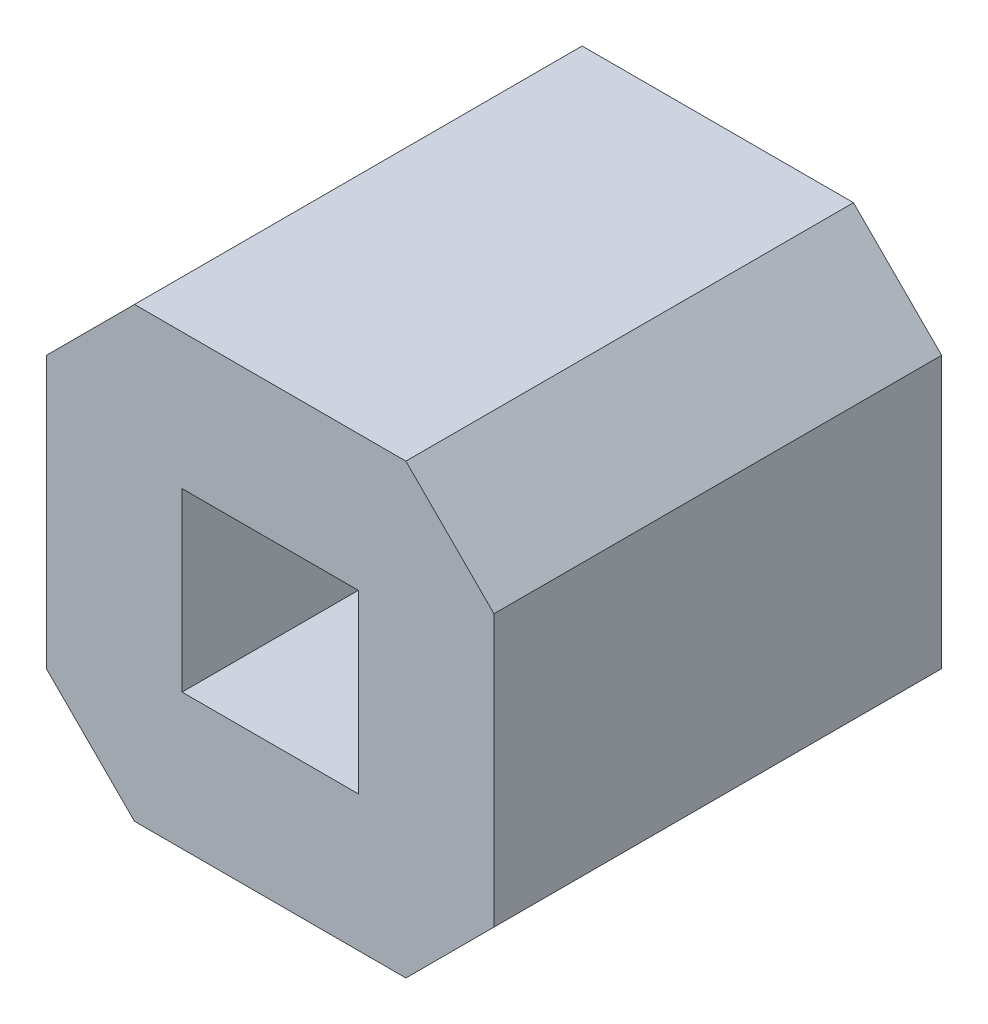
ISO-10303-21;
HEADER;
FILE_DESCRIPTION(('STEP AP214'),'2;1');
FILE_NAME('part.step','',(''),(''),'','','');
FILE_SCHEMA(('AUTOMOTIVE_DESIGN { 1 0 10303 214 1 1 1 1 }'));
ENDSEC;
DATA;
#1=APPLICATION_CONTEXT('core data for automotive mechanical design processes');
#2=APPLICATION_PROTOCOL_DEFINITION('international standard','automotive_design',2000,#1);
#3=PRODUCT_CONTEXT('',#1,'mechanical');
#4=PRODUCT('Part','Part','',(#3));
#5=PRODUCT_RELATED_PRODUCT_CATEGORY('part','',(#4));
#6=PRODUCT_DEFINITION_FORMATION('','',#4);
#7=PRODUCT_DEFINITION_CONTEXT('part definition',#1,'design');
#8=PRODUCT_DEFINITION('design','',#6,#7);
#9=PRODUCT_DEFINITION_SHAPE('','',#8);
#10=(LENGTH_UNIT() NAMED_UNIT(*) SI_UNIT(.MILLI.,.METRE.));
#11=(NAMED_UNIT(*) PLANE_ANGLE_UNIT() SI_UNIT($,.RADIAN.));
#12=(NAMED_UNIT(*) SI_UNIT($,.STERADIAN.) SOLID_ANGLE_UNIT());
#13=UNCERTAINTY_MEASURE_WITH_UNIT(LENGTH_MEASURE(1.E-05),#10,'distance_accuracy_value','');
#14=(GEOMETRIC_REPRESENTATION_CONTEXT(3) GLOBAL_UNCERTAINTY_ASSIGNED_CONTEXT((#13)) GLOBAL_UNIT_ASSIGNED_CONTEXT((#10,
#11,#12)) REPRESENTATION_CONTEXT('',''));
#15=CARTESIAN_POINT('',(0.,0.,0.));
#16=DIRECTION('',(0.,0.,1.));
#17=DIRECTION('',(1.,0.,0.));
#18=AXIS2_PLACEMENT_3D('',#15,#16,#17);
#19=CARTESIAN_POINT('',(-0.77,-1.27,0.));
#20=DIRECTION('',(0.,-1.,0.));
#21=DIRECTION('',(0.,0.,-1.));
#22=AXIS2_PLACEMENT_3D('',#19,#20,#21);
#23=PLANE('',#22);
#24=DIRECTION('',(1.,0.,0.));
#25=VECTOR('',#24,1.);
#26=CARTESIAN_POINT('',(-0.77,-1.27,2.54));
#27=LINE('',#26,#25);
#28=CARTESIAN_POINT('',(0.77,-1.27,2.54));
#29=VERTEX_POINT('',#28);
#30=CARTESIAN_POINT('',(-0.77,-1.27,2.54));
#31=VERTEX_POINT('',#30);
#32=EDGE_CURVE('E105',#29,#31,#27,.F.);
#33=ORIENTED_EDGE('',*,*,#32,.T.);
#34=DIRECTION('',(0.,0.,1.));
#35=VECTOR('',#34,1.);
#36=CARTESIAN_POINT('',(-0.77,-1.27,0.));
#37=LINE('',#36,#35);
#38=CARTESIAN_POINT('',(-0.77,-1.27,0.));
#39=VERTEX_POINT('',#38);
#40=EDGE_CURVE('E114',#39,#31,#37,.T.);
#41=ORIENTED_EDGE('',*,*,#40,.F.);
#42=DIRECTION('',(1.,0.,0.));
#43=VECTOR('',#42,1.);
#44=CARTESIAN_POINT('',(-0.77,-1.27,0.));
#45=LINE('',#44,#43);
#46=CARTESIAN_POINT('',(0.77,-1.27,0.));
#47=VERTEX_POINT('',#46);
#48=EDGE_CURVE('E20',#39,#47,#45,.T.);
#49=ORIENTED_EDGE('',*,*,#48,.T.);
#50=DIRECTION('',(0.,0.,1.));
#51=VECTOR('',#50,1.);
#52=CARTESIAN_POINT('',(0.77,-1.27,0.));
#53=LINE('',#52,#51);
#54=EDGE_CURVE('E134',#29,#47,#53,.F.);
#55=ORIENTED_EDGE('',*,*,#54,.F.);
#56=EDGE_LOOP('',(#33,#41,#49,#55));
#57=FACE_BOUND('',#56,.T.);
#58=ADVANCED_FACE('F17',(#57),#23,.T.);
#59=CARTESIAN_POINT('',(-1.27,-0.77,0.));
#60=DIRECTION('',(-0.707106781186548,-0.707106781186548,0.));
#61=DIRECTION('',(0.707106781186548,-0.707106781186548,0.));
#62=AXIS2_PLACEMENT_3D('',#59,#60,#61);
#63=PLANE('',#62);
#64=DIRECTION('',(0.707106781186548,-0.707106781186548,0.));
#65=VECTOR('',#64,1.);
#66=CARTESIAN_POINT('',(-1.27,-0.77,2.54));
#67=LINE('',#66,#65);
#68=CARTESIAN_POINT('',(-1.27,-0.77,2.54));
#69=VERTEX_POINT('',#68);
#70=EDGE_CURVE('E127',#31,#69,#67,.F.);
#71=ORIENTED_EDGE('',*,*,#70,.T.);
#72=DIRECTION('',(0.,0.,1.));
#73=VECTOR('',#72,1.);
#74=CARTESIAN_POINT('',(-1.27,-0.77,0.));
#75=LINE('',#74,#73);
#76=CARTESIAN_POINT('',(-1.27,-0.77,0.));
#77=VERTEX_POINT('',#76);
#78=EDGE_CURVE('E117',#77,#69,#75,.T.);
#79=ORIENTED_EDGE('',*,*,#78,.F.);
#80=DIRECTION('',(0.707106781186548,-0.707106781186548,0.));
#81=VECTOR('',#80,1.);
#82=CARTESIAN_POINT('',(-1.27,-0.77,0.));
#83=LINE('',#82,#81);
#84=EDGE_CURVE('E111',#77,#39,#83,.T.);
#85=ORIENTED_EDGE('',*,*,#84,.T.);
#86=ORIENTED_EDGE('',*,*,#40,.T.);
#87=EDGE_LOOP('',(#71,#79,#85,#86));
#88=FACE_BOUND('',#87,.T.);
#89=ADVANCED_FACE('F113',(#88),#63,.T.);
#90=CARTESIAN_POINT('',(0.77,-1.27,0.));
#91=DIRECTION('',(0.707106781186548,-0.707106781186547,0.));
#92=DIRECTION('',(0.707106781186547,0.707106781186548,0.));
#93=AXIS2_PLACEMENT_3D('',#90,#91,#92);
#94=PLANE('',#93);
#95=DIRECTION('',(0.707106781186547,0.707106781186548,0.));
#96=VECTOR('',#95,1.);
#97=CARTESIAN_POINT('',(0.77,-1.27,2.54));
#98=LINE('',#97,#96);
#99=CARTESIAN_POINT('',(1.27,-0.77,2.54));
#100=VERTEX_POINT('',#99);
#101=EDGE_CURVE('E132',#100,#29,#98,.F.);
#102=ORIENTED_EDGE('',*,*,#101,.T.);
#103=ORIENTED_EDGE('',*,*,#54,.T.);
#104=DIRECTION('',(0.707106781186547,0.707106781186548,0.));
#105=VECTOR('',#104,1.);
#106=CARTESIAN_POINT('',(0.77,-1.27,0.));
#107=LINE('',#106,#105);
#108=CARTESIAN_POINT('',(1.27,-0.77,0.));
#109=VERTEX_POINT('',#108);
#110=EDGE_CURVE('E125',#47,#109,#107,.T.);
#111=ORIENTED_EDGE('',*,*,#110,.T.);
#112=DIRECTION('',(0.,0.,-1.));
#113=VECTOR('',#112,1.);
#114=CARTESIAN_POINT('',(1.27,-0.77,0.));
#115=LINE('',#114,#113);
#116=EDGE_CURVE('E145',#100,#109,#115,.T.);
#117=ORIENTED_EDGE('',*,*,#116,.F.);
#118=EDGE_LOOP('',(#102,#103,#111,#117));
#119=FACE_BOUND('',#118,.T.);
#120=ADVANCED_FACE('F220',(#119),#94,.T.);
#121=CARTESIAN_POINT('',(-1.27,0.77,0.));
#122=DIRECTION('',(-1.,0.,0.));
#123=DIRECTION('',(0.,0.,1.));
#124=AXIS2_PLACEMENT_3D('',#121,#122,#123);
#125=PLANE('',#124);
#126=DIRECTION('',(0.,1.,0.));
#127=VECTOR('',#126,1.);
#128=CARTESIAN_POINT('',(-1.27,0.77,2.54));
#129=LINE('',#128,#127);
#130=CARTESIAN_POINT('',(-1.27,0.77,2.54));
#131=VERTEX_POINT('',#130);
#132=EDGE_CURVE('E139',#69,#131,#129,.T.);
#133=ORIENTED_EDGE('',*,*,#132,.T.);
#134=DIRECTION('',(0.,0.,1.));
#135=VECTOR('',#134,1.);
#136=CARTESIAN_POINT('',(-1.27,0.77,0.));
#137=LINE('',#136,#135);
#138=CARTESIAN_POINT('',(-1.27,0.77,0.));
#139=VERTEX_POINT('',#138);
#140=EDGE_CURVE('E152',#139,#131,#137,.T.);
#141=ORIENTED_EDGE('',*,*,#140,.F.);
#142=DIRECTION('',(0.,1.,0.));
#143=VECTOR('',#142,1.);
#144=CARTESIAN_POINT('',(-1.27,0.77,0.));
#145=LINE('',#144,#143);
#146=EDGE_CURVE('E136',#139,#77,#145,.F.);
#147=ORIENTED_EDGE('',*,*,#146,.T.);
#148=ORIENTED_EDGE('',*,*,#78,.T.);
#149=EDGE_LOOP('',(#133,#141,#147,#148));
#150=FACE_BOUND('',#149,.T.);
#151=ADVANCED_FACE('F222',(#150),#125,.T.);
#152=CARTESIAN_POINT('',(1.27,-0.77,0.));
#153=DIRECTION('',(1.,0.,0.));
#154=DIRECTION('',(0.,0.,-1.));
#155=AXIS2_PLACEMENT_3D('',#152,#153,#154);
#156=PLANE('',#155);
#157=DIRECTION('',(0.,1.,0.));
#158=VECTOR('',#157,1.);
#159=CARTESIAN_POINT('',(1.27,-0.77,2.54));
#160=LINE('',#159,#158);
#161=CARTESIAN_POINT('',(1.27,0.77,2.54));
#162=VERTEX_POINT('',#161);
#163=EDGE_CURVE('E143',#162,#100,#160,.F.);
#164=ORIENTED_EDGE('',*,*,#163,.T.);
#165=ORIENTED_EDGE('',*,*,#116,.T.);
#166=DIRECTION('',(0.,1.,0.));
#167=VECTOR('',#166,1.);
#168=CARTESIAN_POINT('',(1.27,-0.77,0.));
#169=LINE('',#168,#167);
#170=CARTESIAN_POINT('',(1.27,0.77,0.));
#171=VERTEX_POINT('',#170);
#172=EDGE_CURVE('E141',#109,#171,#169,.T.);
#173=ORIENTED_EDGE('',*,*,#172,.T.);
#174=DIRECTION('',(0.,0.,1.));
#175=VECTOR('',#174,1.);
#176=CARTESIAN_POINT('',(1.27,0.77,0.));
#177=LINE('',#176,#175);
#178=EDGE_CURVE('E157',#162,#171,#177,.F.);
#179=ORIENTED_EDGE('',*,*,#178,.F.);
#180=EDGE_LOOP('',(#164,#165,#173,#179));
#181=FACE_BOUND('',#180,.T.);
#182=ADVANCED_FACE('F216',(#181),#156,.T.);
#183=CARTESIAN_POINT('',(0.5,-0.5,0.));
#184=DIRECTION('',(1.,0.,0.));
#185=DIRECTION('',(0.,0.,-1.));
#186=AXIS2_PLACEMENT_3D('',#183,#184,#185);
#187=PLANE('',#186);
#188=DIRECTION('',(0.,0.,-1.));
#189=VECTOR('',#188,1.);
#190=CARTESIAN_POINT('',(0.5,-0.5,0.));
#191=LINE('',#190,#189);
#192=CARTESIAN_POINT('',(0.5,-0.5,0.));
#193=VERTEX_POINT('',#192);
#194=CARTESIAN_POINT('',(0.5,-0.5,2.54));
#195=VERTEX_POINT('',#194);
#196=EDGE_CURVE('E160',#193,#195,#191,.F.);
#197=ORIENTED_EDGE('',*,*,#196,.T.);
#198=DIRECTION('',(0.,1.,0.));
#199=VECTOR('',#198,1.);
#200=CARTESIAN_POINT('',(0.5,0.,2.54));
#201=LINE('',#200,#199);
#202=CARTESIAN_POINT('',(0.5,0.5,2.54));
#203=VERTEX_POINT('',#202);
#204=EDGE_CURVE('E169',#203,#195,#201,.F.);
#205=ORIENTED_EDGE('',*,*,#204,.F.);
#206=DIRECTION('',(0.,0.,1.));
#207=VECTOR('',#206,1.);
#208=CARTESIAN_POINT('',(0.5,0.5,0.));
#209=LINE('',#208,#207);
#210=CARTESIAN_POINT('',(0.5,0.5,0.));
#211=VERTEX_POINT('',#210);
#212=EDGE_CURVE('E176',#203,#211,#209,.F.);
#213=ORIENTED_EDGE('',*,*,#212,.T.);
#214=DIRECTION('',(0.,1.,0.));
#215=VECTOR('',#214,1.);
#216=CARTESIAN_POINT('',(0.5,-0.5,0.));
#217=LINE('',#216,#215);
#218=EDGE_CURVE('E148',#193,#211,#217,.T.);
#219=ORIENTED_EDGE('',*,*,#218,.F.);
#220=EDGE_LOOP('',(#197,#205,#213,#219));
#221=FACE_BOUND('',#220,.T.);
#222=ADVANCED_FACE('F230',(#221),#187,.F.);
#223=CARTESIAN_POINT('',(-0.77,1.27,0.));
#224=DIRECTION('',(-0.707106781186548,0.707106781186548,0.));
#225=DIRECTION('',(-0.707106781186548,-0.707106781186548,0.));
#226=AXIS2_PLACEMENT_3D('',#223,#224,#225);
#227=PLANE('',#226);
#228=DIRECTION('',(-0.707106781186548,-0.707106781186548,0.));
#229=VECTOR('',#228,1.);
#230=CARTESIAN_POINT('',(-0.77,1.27,2.54));
#231=LINE('',#230,#229);
#232=CARTESIAN_POINT('',(-0.77,1.27,2.54));
#233=VERTEX_POINT('',#232);
#234=EDGE_CURVE('E164',#233,#131,#231,.T.);
#235=ORIENTED_EDGE('',*,*,#234,.F.);
#236=DIRECTION('',(0.,0.,1.));
#237=VECTOR('',#236,1.);
#238=CARTESIAN_POINT('',(-0.77,1.27,0.));
#239=LINE('',#238,#237);
#240=CARTESIAN_POINT('',(-0.77,1.27,0.));
#241=VERTEX_POINT('',#240);
#242=EDGE_CURVE('E181',#241,#233,#239,.T.);
#243=ORIENTED_EDGE('',*,*,#242,.F.);
#244=DIRECTION('',(-0.707106781186548,-0.707106781186548,0.));
#245=VECTOR('',#244,1.);
#246=CARTESIAN_POINT('',(-0.77,1.27,0.));
#247=LINE('',#246,#245);
#248=EDGE_CURVE('E150',#241,#139,#247,.T.);
#249=ORIENTED_EDGE('',*,*,#248,.T.);
#250=ORIENTED_EDGE('',*,*,#140,.T.);
#251=EDGE_LOOP('',(#235,#243,#249,#250));
#252=FACE_BOUND('',#251,.T.);
#253=ADVANCED_FACE('F206',(#252),#227,.T.);
#254=CARTESIAN_POINT('',(1.27,0.77,0.));
#255=DIRECTION('',(0.707106781186548,0.707106781186548,0.));
#256=DIRECTION('',(-0.707106781186548,0.707106781186548,0.));
#257=AXIS2_PLACEMENT_3D('',#254,#255,#256);
#258=PLANE('',#257);
#259=DIRECTION('',(-0.707106781186548,0.707106781186548,0.));
#260=VECTOR('',#259,1.);
#261=CARTESIAN_POINT('',(1.27,0.77,2.54));
#262=LINE('',#261,#260);
#263=CARTESIAN_POINT('',(0.77,1.27,2.54));
#264=VERTEX_POINT('',#263);
#265=EDGE_CURVE('E167',#162,#264,#262,.T.);
#266=ORIENTED_EDGE('',*,*,#265,.F.);
#267=ORIENTED_EDGE('',*,*,#178,.T.);
#268=DIRECTION('',(-0.707106781186548,0.707106781186548,0.));
#269=VECTOR('',#268,1.);
#270=CARTESIAN_POINT('',(1.27,0.77,0.));
#271=LINE('',#270,#269);
#272=CARTESIAN_POINT('',(0.77,1.27,0.));
#273=VERTEX_POINT('',#272);
#274=EDGE_CURVE('E155',#171,#273,#271,.T.);
#275=ORIENTED_EDGE('',*,*,#274,.T.);
#276=DIRECTION('',(0.,0.,1.));
#277=VECTOR('',#276,1.);
#278=CARTESIAN_POINT('',(0.77,1.27,0.));
#279=LINE('',#278,#277);
#280=EDGE_CURVE('E186',#264,#273,#279,.F.);
#281=ORIENTED_EDGE('',*,*,#280,.F.);
#282=EDGE_LOOP('',(#266,#267,#275,#281));
#283=FACE_BOUND('',#282,.T.);
#284=ADVANCED_FACE('F213',(#283),#258,.T.);
#285=CARTESIAN_POINT('',(-0.5,-0.5,0.));
#286=DIRECTION('',(0.,-1.,0.));
#287=DIRECTION('',(0.,0.,-1.));
#288=AXIS2_PLACEMENT_3D('',#285,#286,#287);
#289=PLANE('',#288);
#290=DIRECTION('',(0.,0.,1.));
#291=VECTOR('',#290,1.);
#292=CARTESIAN_POINT('',(-0.5,-0.5,0.));
#293=LINE('',#292,#291);
#294=CARTESIAN_POINT('',(-0.5,-0.5,0.));
#295=VERTEX_POINT('',#294);
#296=CARTESIAN_POINT('',(-0.5,-0.5,2.54));
#297=VERTEX_POINT('',#296);
#298=EDGE_CURVE('E189',#295,#297,#293,.T.);
#299=ORIENTED_EDGE('',*,*,#298,.T.);
#300=DIRECTION('',(1.,0.,0.));
#301=VECTOR('',#300,1.);
#302=CARTESIAN_POINT('',(0.,-0.5,2.54));
#303=LINE('',#302,#301);
#304=EDGE_CURVE('E171',#195,#297,#303,.F.);
#305=ORIENTED_EDGE('',*,*,#304,.F.);
#306=ORIENTED_EDGE('',*,*,#196,.F.);
#307=DIRECTION('',(1.,0.,0.));
#308=VECTOR('',#307,1.);
#309=CARTESIAN_POINT('',(-0.5,-0.5,0.));
#310=LINE('',#309,#308);
#311=EDGE_CURVE('E35',#295,#193,#310,.T.);
#312=ORIENTED_EDGE('',*,*,#311,.F.);
#313=EDGE_LOOP('',(#299,#305,#306,#312));
#314=FACE_BOUND('',#313,.T.);
#315=ADVANCED_FACE('F251',(#314),#289,.F.);
#316=CARTESIAN_POINT('',(0.,0.,2.54));
#317=DIRECTION('',(0.,0.,1.));
#318=DIRECTION('',(1.,0.,0.));
#319=AXIS2_PLACEMENT_3D('',#316,#317,#318);
#320=PLANE('',#319);
#321=ORIENTED_EDGE('',*,*,#204,.T.);
#322=ORIENTED_EDGE('',*,*,#304,.T.);
#323=DIRECTION('',(0.,1.,0.));
#324=VECTOR('',#323,1.);
#325=CARTESIAN_POINT('',(-0.5,0.5,2.54));
#326=LINE('',#325,#324);
#327=CARTESIAN_POINT('',(-0.5,0.5,2.54));
#328=VERTEX_POINT('',#327);
#329=EDGE_CURVE('E191',#297,#328,#326,.T.);
#330=ORIENTED_EDGE('',*,*,#329,.T.);
#331=DIRECTION('',(1.,0.,0.));
#332=VECTOR('',#331,1.);
#333=CARTESIAN_POINT('',(0.5,0.5,2.54));
#334=LINE('',#333,#332);
#335=EDGE_CURVE('E173',#328,#203,#334,.T.);
#336=ORIENTED_EDGE('',*,*,#335,.T.);
#337=EDGE_LOOP('',(#321,#322,#330,#336));
#338=FACE_BOUND('',#337,.T.);
#339=ORIENTED_EDGE('',*,*,#265,.T.);
#340=DIRECTION('',(1.,0.,0.));
#341=VECTOR('',#340,1.);
#342=CARTESIAN_POINT('',(0.77,1.27,2.54));
#343=LINE('',#342,#341);
#344=EDGE_CURVE('E183',#233,#264,#343,.T.);
#345=ORIENTED_EDGE('',*,*,#344,.F.);
#346=ORIENTED_EDGE('',*,*,#234,.T.);
#347=ORIENTED_EDGE('',*,*,#132,.F.);
#348=ORIENTED_EDGE('',*,*,#70,.F.);
#349=ORIENTED_EDGE('',*,*,#32,.F.);
#350=ORIENTED_EDGE('',*,*,#101,.F.);
#351=ORIENTED_EDGE('',*,*,#163,.F.);
#352=EDGE_LOOP('',(#339,#345,#346,#347,#348,#349,#350,#351));
#353=FACE_BOUND('',#352,.T.);
#354=ADVANCED_FACE('F210',(#338,#353),#320,.T.);
#355=CARTESIAN_POINT('',(0.5,0.5,0.));
#356=DIRECTION('',(0.,1.,0.));
#357=DIRECTION('',(0.,0.,1.));
#358=AXIS2_PLACEMENT_3D('',#355,#356,#357);
#359=PLANE('',#358);
#360=ORIENTED_EDGE('',*,*,#212,.F.);
#361=ORIENTED_EDGE('',*,*,#335,.F.);
#362=DIRECTION('',(0.,0.,1.));
#363=VECTOR('',#362,1.);
#364=CARTESIAN_POINT('',(-0.5,0.5,0.));
#365=LINE('',#364,#363);
#366=CARTESIAN_POINT('',(-0.5,0.5,0.));
#367=VERTEX_POINT('',#366);
#368=EDGE_CURVE('E194',#328,#367,#365,.F.);
#369=ORIENTED_EDGE('',*,*,#368,.T.);
#370=DIRECTION('',(1.,0.,0.));
#371=VECTOR('',#370,1.);
#372=CARTESIAN_POINT('',(0.5,0.5,0.));
#373=LINE('',#372,#371);
#374=EDGE_CURVE('E179',#211,#367,#373,.F.);
#375=ORIENTED_EDGE('',*,*,#374,.F.);
#376=EDGE_LOOP('',(#360,#361,#369,#375));
#377=FACE_BOUND('',#376,.T.);
#378=ADVANCED_FACE('F245',(#377),#359,.F.);
#379=CARTESIAN_POINT('',(0.77,1.27,0.));
#380=DIRECTION('',(0.,1.,0.));
#381=DIRECTION('',(0.,0.,1.));
#382=AXIS2_PLACEMENT_3D('',#379,#380,#381);
#383=PLANE('',#382);
#384=ORIENTED_EDGE('',*,*,#344,.T.);
#385=ORIENTED_EDGE('',*,*,#280,.T.);
#386=DIRECTION('',(1.,0.,0.));
#387=VECTOR('',#386,1.);
#388=CARTESIAN_POINT('',(0.,1.27,0.));
#389=LINE('',#388,#387);
#390=EDGE_CURVE('E26',#273,#241,#389,.F.);
#391=ORIENTED_EDGE('',*,*,#390,.T.);
#392=ORIENTED_EDGE('',*,*,#242,.T.);
#393=EDGE_LOOP('',(#384,#385,#391,#392));
#394=FACE_BOUND('',#393,.T.);
#395=ADVANCED_FACE('F199',(#394),#383,.T.);
#396=CARTESIAN_POINT('',(-0.5,0.5,0.));
#397=DIRECTION('',(-1.,0.,0.));
#398=DIRECTION('',(0.,0.,1.));
#399=AXIS2_PLACEMENT_3D('',#396,#397,#398);
#400=PLANE('',#399);
#401=ORIENTED_EDGE('',*,*,#368,.F.);
#402=ORIENTED_EDGE('',*,*,#329,.F.);
#403=ORIENTED_EDGE('',*,*,#298,.F.);
#404=DIRECTION('',(0.,1.,0.));
#405=VECTOR('',#404,1.);
#406=CARTESIAN_POINT('',(-0.5,0.,0.));
#407=LINE('',#406,#405);
#408=EDGE_CURVE('E11',#295,#367,#407,.T.);
#409=ORIENTED_EDGE('',*,*,#408,.T.);
#410=EDGE_LOOP('',(#401,#402,#403,#409));
#411=FACE_BOUND('',#410,.T.);
#412=ADVANCED_FACE('F234',(#411),#400,.F.);
#413=CARTESIAN_POINT('',(0.,0.,0.));
#414=DIRECTION('',(0.,0.,1.));
#415=DIRECTION('',(1.,0.,0.));
#416=AXIS2_PLACEMENT_3D('',#413,#414,#415);
#417=PLANE('',#416);
#418=ORIENTED_EDGE('',*,*,#311,.T.);
#419=ORIENTED_EDGE('',*,*,#218,.T.);
#420=ORIENTED_EDGE('',*,*,#374,.T.);
#421=ORIENTED_EDGE('',*,*,#408,.F.);
#422=EDGE_LOOP('',(#418,#419,#420,#421));
#423=FACE_BOUND('',#422,.T.);
#424=ORIENTED_EDGE('',*,*,#390,.F.);
#425=ORIENTED_EDGE('',*,*,#274,.F.);
#426=ORIENTED_EDGE('',*,*,#172,.F.);
#427=ORIENTED_EDGE('',*,*,#110,.F.);
#428=ORIENTED_EDGE('',*,*,#48,.F.);
#429=ORIENTED_EDGE('',*,*,#84,.F.);
#430=ORIENTED_EDGE('',*,*,#146,.F.);
#431=ORIENTED_EDGE('',*,*,#248,.F.);
#432=EDGE_LOOP('',(#424,#425,#426,#427,#428,#429,#430,#431));
#433=FACE_BOUND('',#432,.T.);
#434=ADVANCED_FACE('F123',(#423,#433),#417,.F.);
#435=CLOSED_SHELL('',(#58,#89,#120,#151,#182,#222,#253,#284,#315,#354,#378,#395,#412,#434));
#436=MANIFOLD_SOLID_BREP('B1',#435);
#437=ADVANCED_BREP_SHAPE_REPRESENTATION('',(#18,#436),#14);
#438=SHAPE_DEFINITION_REPRESENTATION(#9,#437);
ENDSEC;
END-ISO-10303-21;
